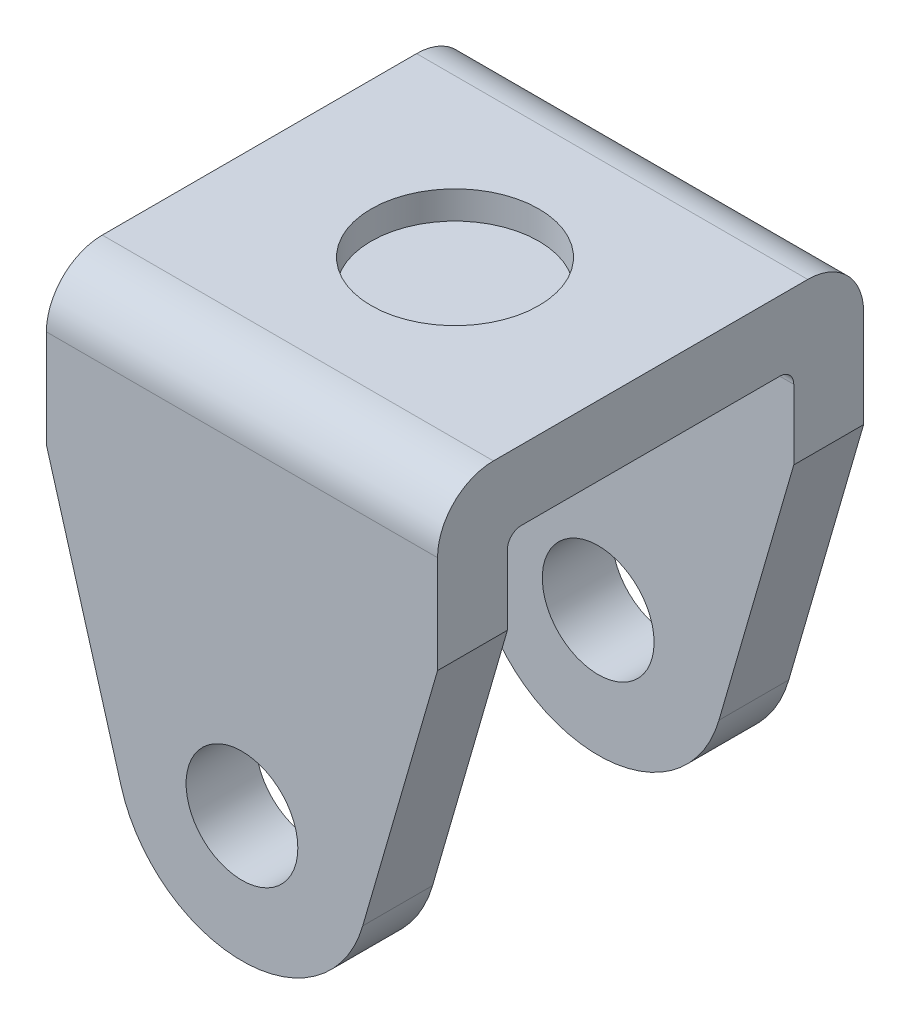
ISO-10303-21;
HEADER;
FILE_DESCRIPTION(('STEP AP214'),'2;1');
FILE_NAME('part.step','',(''),(''),'','','');
FILE_SCHEMA(('AUTOMOTIVE_DESIGN { 1 0 10303 214 1 1 1 1 }'));
ENDSEC;
DATA;
#1=APPLICATION_CONTEXT('core data for automotive mechanical design processes');
#2=APPLICATION_PROTOCOL_DEFINITION('international standard','automotive_design',2000,#1);
#3=PRODUCT_CONTEXT('',#1,'mechanical');
#4=PRODUCT('Part','Part','',(#3));
#5=PRODUCT_RELATED_PRODUCT_CATEGORY('part','',(#4));
#6=PRODUCT_DEFINITION_FORMATION('','',#4);
#7=PRODUCT_DEFINITION_CONTEXT('part definition',#1,'design');
#8=PRODUCT_DEFINITION('design','',#6,#7);
#9=PRODUCT_DEFINITION_SHAPE('','',#8);
#10=(LENGTH_UNIT() NAMED_UNIT(*) SI_UNIT(.MILLI.,.METRE.));
#11=(NAMED_UNIT(*) PLANE_ANGLE_UNIT() SI_UNIT($,.RADIAN.));
#12=(NAMED_UNIT(*) SI_UNIT($,.STERADIAN.) SOLID_ANGLE_UNIT());
#13=UNCERTAINTY_MEASURE_WITH_UNIT(LENGTH_MEASURE(1.E-05),#10,'distance_accuracy_value','');
#14=(GEOMETRIC_REPRESENTATION_CONTEXT(3) GLOBAL_UNCERTAINTY_ASSIGNED_CONTEXT((#13)) GLOBAL_UNIT_ASSIGNED_CONTEXT((#10,
#11,#12)) REPRESENTATION_CONTEXT('',''));
#15=CARTESIAN_POINT('',(0.,0.,0.));
#16=DIRECTION('',(0.,0.,1.));
#17=DIRECTION('',(1.,0.,0.));
#18=AXIS2_PLACEMENT_3D('',#15,#16,#17);
#19=CARTESIAN_POINT('',(0.,34.,0.));
#20=DIRECTION('',(0.,1.,0.));
#21=DIRECTION('',(0.,0.,1.));
#22=AXIS2_PLACEMENT_3D('',#19,#20,#21);
#23=PLANE('',#22);
#24=CARTESIAN_POINT('',(0.,34.,0.));
#25=DIRECTION('',(0.,1.,0.));
#26=DIRECTION('',(0.,0.,1.));
#27=AXIS2_PLACEMENT_3D('',#24,#25,#26);
#28=CIRCLE('',#27,6.);
#29=CARTESIAN_POINT('',(0.,34.,6.));
#30=VERTEX_POINT('',#29);
#31=EDGE_CURVE('E20',#30,#30,#28,.T.);
#32=ORIENTED_EDGE('',*,*,#31,.T.);
#33=EDGE_LOOP('',(#32));
#34=FACE_BOUND('',#33,.T.);
#35=ADVANCED_FACE('F17',(#34),#23,.T.);
#36=CARTESIAN_POINT('',(0.,34.,0.));
#37=DIRECTION('',(0.,1.,0.));
#38=DIRECTION('',(0.,0.,1.));
#39=AXIS2_PLACEMENT_3D('',#36,#37,#38);
#40=CYLINDRICAL_SURFACE('',#39,6.);
#41=CARTESIAN_POINT('',(0.,36.,0.));
#42=DIRECTION('',(0.,1.,0.));
#43=DIRECTION('',(0.,0.,1.));
#44=AXIS2_PLACEMENT_3D('',#41,#42,#43);
#45=CIRCLE('',#44,6.);
#46=CARTESIAN_POINT('',(0.,36.,6.));
#47=VERTEX_POINT('',#46);
#48=EDGE_CURVE('E147',#47,#47,#45,.F.);
#49=ORIENTED_EDGE('',*,*,#48,.F.);
#50=EDGE_LOOP('',(#49));
#51=FACE_BOUND('',#50,.T.);
#52=ORIENTED_EDGE('',*,*,#31,.F.);
#53=EDGE_LOOP('',(#52));
#54=FACE_BOUND('',#53,.T.);
#55=ADVANCED_FACE('F500',(#51,#54),#40,.F.);
#56=CARTESIAN_POINT('',(-14.,30.,9.25));
#57=DIRECTION('',(-1.,0.,0.));
#58=DIRECTION('',(0.,0.,1.));
#59=AXIS2_PLACEMENT_3D('',#56,#57,#58);
#60=CYLINDRICAL_SURFACE('',#59,1.);
#61=DIRECTION('',(1.,0.,0.));
#62=VECTOR('',#61,1.);
#63=CARTESIAN_POINT('',(-14.,31.,9.25));
#64=LINE('',#63,#62);
#65=CARTESIAN_POINT('',(-14.,31.,9.25));
#66=VERTEX_POINT('',#65);
#67=CARTESIAN_POINT('',(14.,31.,9.25));
#68=VERTEX_POINT('',#67);
#69=EDGE_CURVE('E141',#66,#68,#64,.T.);
#70=ORIENTED_EDGE('',*,*,#69,.T.);
#71=CARTESIAN_POINT('',(14.,30.,9.25));
#72=DIRECTION('',(-1.,0.,0.));
#73=DIRECTION('',(0.,0.,1.));
#74=AXIS2_PLACEMENT_3D('',#71,#72,#73);
#75=CIRCLE('',#74,1.);
#76=CARTESIAN_POINT('',(14.,30.,10.25));
#77=VERTEX_POINT('',#76);
#78=EDGE_CURVE('E129',#77,#68,#75,.T.);
#79=ORIENTED_EDGE('',*,*,#78,.F.);
#80=DIRECTION('',(1.,0.,0.));
#81=VECTOR('',#80,1.);
#82=CARTESIAN_POINT('',(-14.,30.,10.25));
#83=LINE('',#82,#81);
#84=CARTESIAN_POINT('',(-14.,30.,10.25));
#85=VERTEX_POINT('',#84);
#86=EDGE_CURVE('E250',#77,#85,#83,.F.);
#87=ORIENTED_EDGE('',*,*,#86,.T.);
#88=CARTESIAN_POINT('',(-14.,30.,9.25));
#89=DIRECTION('',(-1.,0.,0.));
#90=DIRECTION('',(0.,0.,1.));
#91=AXIS2_PLACEMENT_3D('',#88,#89,#90);
#92=CIRCLE('',#91,1.);
#93=EDGE_CURVE('E139',#66,#85,#92,.F.);
#94=ORIENTED_EDGE('',*,*,#93,.F.);
#95=EDGE_LOOP('',(#70,#79,#87,#94));
#96=FACE_BOUND('',#95,.T.);
#97=ADVANCED_FACE('F142',(#96),#60,.F.);
#98=CARTESIAN_POINT('',(0.,9.,-15.25));
#99=DIRECTION('',(0.,0.,1.));
#100=DIRECTION('',(1.,0.,0.));
#101=AXIS2_PLACEMENT_3D('',#98,#99,#100);
#102=CYLINDRICAL_SURFACE('',#101,9.00000000000001);
#103=CARTESIAN_POINT('',(0.,9.,10.25));
#104=DIRECTION('',(0.,0.,1.));
#105=DIRECTION('',(1.,0.,0.));
#106=AXIS2_PLACEMENT_3D('',#103,#104,#105);
#107=CIRCLE('',#106,9.00000000000001);
#108=CARTESIAN_POINT('',(-8.64521212595838,6.49793938978643,10.25));
#109=VERTEX_POINT('',#108);
#110=CARTESIAN_POINT('',(8.64521212595838,6.49793938978643,10.25));
#111=VERTEX_POINT('',#110);
#112=EDGE_CURVE('E249',#109,#111,#107,.T.);
#113=ORIENTED_EDGE('',*,*,#112,.T.);
#114=DIRECTION('',(0.,0.,1.));
#115=VECTOR('',#114,1.);
#116=CARTESIAN_POINT('',(8.64521212595838,6.49793938978642,-15.25));
#117=LINE('',#116,#115);
#118=CARTESIAN_POINT('',(8.64521212595838,6.49793938978643,15.25));
#119=VERTEX_POINT('',#118);
#120=EDGE_CURVE('E230',#111,#119,#117,.T.);
#121=ORIENTED_EDGE('',*,*,#120,.T.);
#122=CARTESIAN_POINT('',(0.,9.,15.25));
#123=DIRECTION('',(0.,0.,1.));
#124=DIRECTION('',(1.,0.,0.));
#125=AXIS2_PLACEMENT_3D('',#122,#123,#124);
#126=CIRCLE('',#125,9.00000000000001);
#127=CARTESIAN_POINT('',(-8.64521212595838,6.49793938978643,15.25));
#128=VERTEX_POINT('',#127);
#129=EDGE_CURVE('E224',#119,#128,#126,.F.);
#130=ORIENTED_EDGE('',*,*,#129,.T.);
#131=DIRECTION('',(0.,0.,1.));
#132=VECTOR('',#131,1.);
#133=CARTESIAN_POINT('',(-8.64521212595838,6.49793938978642,-15.25));
#134=LINE('',#133,#132);
#135=EDGE_CURVE('E266',#128,#109,#134,.F.);
#136=ORIENTED_EDGE('',*,*,#135,.T.);
#137=EDGE_LOOP('',(#113,#121,#130,#136));
#138=FACE_BOUND('',#137,.T.);
#139=ADVANCED_FACE('F368',(#138),#102,.T.);
#140=CARTESIAN_POINT('',(0.,9.,-15.25));
#141=DIRECTION('',(0.,0.,1.));
#142=DIRECTION('',(1.,0.,0.));
#143=AXIS2_PLACEMENT_3D('',#140,#141,#142);
#144=CYLINDRICAL_SURFACE('',#143,4.);
#145=CARTESIAN_POINT('',(0.,9.,15.25));
#146=DIRECTION('',(0.,0.,1.));
#147=DIRECTION('',(1.,0.,0.));
#148=AXIS2_PLACEMENT_3D('',#145,#146,#147);
#149=CIRCLE('',#148,4.);
#150=CARTESIAN_POINT('',(4.,9.,15.25));
#151=VERTEX_POINT('',#150);
#152=EDGE_CURVE('E259',#151,#151,#149,.T.);
#153=ORIENTED_EDGE('',*,*,#152,.T.);
#154=EDGE_LOOP('',(#153));
#155=FACE_BOUND('',#154,.T.);
#156=CARTESIAN_POINT('',(0.,9.,10.25));
#157=DIRECTION('',(0.,0.,1.));
#158=DIRECTION('',(1.,0.,0.));
#159=AXIS2_PLACEMENT_3D('',#156,#157,#158);
#160=CIRCLE('',#159,4.);
#161=CARTESIAN_POINT('',(4.,9.,10.25));
#162=VERTEX_POINT('',#161);
#163=EDGE_CURVE('E243',#162,#162,#160,.F.);
#164=ORIENTED_EDGE('',*,*,#163,.T.);
#165=EDGE_LOOP('',(#164));
#166=FACE_BOUND('',#165,.T.);
#167=ADVANCED_FACE('F360',(#155,#166),#144,.F.);
#168=CARTESIAN_POINT('',(-14.,30.,-9.25));
#169=DIRECTION('',(-1.,0.,0.));
#170=DIRECTION('',(0.,0.,1.));
#171=AXIS2_PLACEMENT_3D('',#168,#169,#170);
#172=CYLINDRICAL_SURFACE('',#171,0.999999999999999);
#173=DIRECTION('',(-1.,0.,0.));
#174=VECTOR('',#173,1.);
#175=CARTESIAN_POINT('',(-14.,30.,-10.25));
#176=LINE('',#175,#174);
#177=CARTESIAN_POINT('',(-14.,30.,-10.25));
#178=VERTEX_POINT('',#177);
#179=CARTESIAN_POINT('',(14.,30.,-10.25));
#180=VERTEX_POINT('',#179);
#181=EDGE_CURVE('E255',#178,#180,#176,.F.);
#182=ORIENTED_EDGE('',*,*,#181,.T.);
#183=CARTESIAN_POINT('',(14.,30.,-9.25));
#184=DIRECTION('',(-1.,0.,0.));
#185=DIRECTION('',(0.,0.,1.));
#186=AXIS2_PLACEMENT_3D('',#183,#184,#185);
#187=CIRCLE('',#186,0.999999999999999);
#188=CARTESIAN_POINT('',(14.,31.,-9.25));
#189=VERTEX_POINT('',#188);
#190=EDGE_CURVE('E302',#189,#180,#187,.T.);
#191=ORIENTED_EDGE('',*,*,#190,.F.);
#192=DIRECTION('',(1.,0.,0.));
#193=VECTOR('',#192,1.);
#194=CARTESIAN_POINT('',(-14.,31.,-9.25));
#195=LINE('',#194,#193);
#196=CARTESIAN_POINT('',(-14.,31.,-9.25));
#197=VERTEX_POINT('',#196);
#198=EDGE_CURVE('E146',#189,#197,#195,.F.);
#199=ORIENTED_EDGE('',*,*,#198,.T.);
#200=CARTESIAN_POINT('',(-14.,30.,-9.25));
#201=DIRECTION('',(-1.,0.,0.));
#202=DIRECTION('',(0.,0.,1.));
#203=AXIS2_PLACEMENT_3D('',#200,#201,#202);
#204=CIRCLE('',#203,0.999999999999999);
#205=EDGE_CURVE('E276',#178,#197,#204,.F.);
#206=ORIENTED_EDGE('',*,*,#205,.F.);
#207=EDGE_LOOP('',(#182,#191,#199,#206));
#208=FACE_BOUND('',#207,.T.);
#209=ADVANCED_FACE('F358',(#208),#172,.F.);
#210=CARTESIAN_POINT('',(-8.64521212595838,6.49793938978642,-15.25));
#211=DIRECTION('',(0.960579125106486,0.278006734468175,0.));
#212=DIRECTION('',(-0.278006734468175,0.960579125106486,0.));
#213=AXIS2_PLACEMENT_3D('',#210,#211,#212);
#214=PLANE('',#213);
#215=DIRECTION('',(-0.278006734468175,0.960579125106486,0.));
#216=VECTOR('',#215,1.);
#217=CARTESIAN_POINT('',(-8.64521212595838,6.49793938978642,15.25));
#218=LINE('',#217,#216);
#219=CARTESIAN_POINT('',(-14.,25.,15.25));
#220=VERTEX_POINT('',#219);
#221=EDGE_CURVE('E228',#128,#220,#218,.T.);
#222=ORIENTED_EDGE('',*,*,#221,.T.);
#223=DIRECTION('',(0.,0.,-1.));
#224=VECTOR('',#223,1.);
#225=CARTESIAN_POINT('',(-14.,25.,-15.25));
#226=LINE('',#225,#224);
#227=CARTESIAN_POINT('',(-14.,25.,10.25));
#228=VERTEX_POINT('',#227);
#229=EDGE_CURVE('E208',#220,#228,#226,.T.);
#230=ORIENTED_EDGE('',*,*,#229,.T.);
#231=DIRECTION('',(0.278006734468175,-0.960579125106486,0.));
#232=VECTOR('',#231,1.);
#233=CARTESIAN_POINT('',(-14.,25.,10.25));
#234=LINE('',#233,#232);
#235=EDGE_CURVE('E246',#228,#109,#234,.T.);
#236=ORIENTED_EDGE('',*,*,#235,.T.);
#237=ORIENTED_EDGE('',*,*,#135,.F.);
#238=EDGE_LOOP('',(#222,#230,#236,#237));
#239=FACE_BOUND('',#238,.T.);
#240=ADVANCED_FACE('F312',(#239),#214,.F.);
#241=CARTESIAN_POINT('',(0.,32.,11.25));
#242=DIRECTION('',(-1.,0.,0.));
#243=DIRECTION('',(0.,0.,1.));
#244=AXIS2_PLACEMENT_3D('',#241,#242,#243);
#245=CYLINDRICAL_SURFACE('',#244,4.);
#246=CARTESIAN_POINT('',(14.,32.,11.25));
#247=DIRECTION('',(-1.,0.,0.));
#248=DIRECTION('',(0.,0.,1.));
#249=AXIS2_PLACEMENT_3D('',#246,#247,#248);
#250=CIRCLE('',#249,4.);
#251=CARTESIAN_POINT('',(14.,32.,15.25));
#252=VERTEX_POINT('',#251);
#253=CARTESIAN_POINT('',(14.,36.,11.25));
#254=VERTEX_POINT('',#253);
#255=EDGE_CURVE('E167',#252,#254,#250,.T.);
#256=ORIENTED_EDGE('',*,*,#255,.T.);
#257=DIRECTION('',(1.,0.,0.));
#258=VECTOR('',#257,1.);
#259=CARTESIAN_POINT('',(0.,36.,11.25));
#260=LINE('',#259,#258);
#261=CARTESIAN_POINT('',(-14.,36.,11.25));
#262=VERTEX_POINT('',#261);
#263=EDGE_CURVE('E264',#262,#254,#260,.T.);
#264=ORIENTED_EDGE('',*,*,#263,.F.);
#265=CARTESIAN_POINT('',(-14.,32.,11.25));
#266=DIRECTION('',(-1.,0.,0.));
#267=DIRECTION('',(0.,0.,1.));
#268=AXIS2_PLACEMENT_3D('',#265,#266,#267);
#269=CIRCLE('',#268,4.);
#270=CARTESIAN_POINT('',(-14.,32.,15.25));
#271=VERTEX_POINT('',#270);
#272=EDGE_CURVE('E214',#262,#271,#269,.F.);
#273=ORIENTED_EDGE('',*,*,#272,.T.);
#274=DIRECTION('',(-1.,0.,0.));
#275=VECTOR('',#274,1.);
#276=CARTESIAN_POINT('',(-14.,32.,15.25));
#277=LINE('',#276,#275);
#278=EDGE_CURVE('E225',#271,#252,#277,.F.);
#279=ORIENTED_EDGE('',*,*,#278,.T.);
#280=EDGE_LOOP('',(#256,#264,#273,#279));
#281=FACE_BOUND('',#280,.T.);
#282=ADVANCED_FACE('F322',(#281),#245,.T.);
#283=CARTESIAN_POINT('',(0.,36.,0.));
#284=DIRECTION('',(0.,1.,0.));
#285=DIRECTION('',(0.,0.,1.));
#286=AXIS2_PLACEMENT_3D('',#283,#284,#285);
#287=PLANE('',#286);
#288=ORIENTED_EDGE('',*,*,#48,.T.);
#289=EDGE_LOOP('',(#288));
#290=FACE_BOUND('',#289,.T.);
#291=DIRECTION('',(0.,0.,-1.));
#292=VECTOR('',#291,1.);
#293=CARTESIAN_POINT('',(-14.,36.,-15.25));
#294=LINE('',#293,#292);
#295=CARTESIAN_POINT('',(-14.,36.,-11.25));
#296=VERTEX_POINT('',#295);
#297=EDGE_CURVE('E217',#296,#262,#294,.F.);
#298=ORIENTED_EDGE('',*,*,#297,.T.);
#299=ORIENTED_EDGE('',*,*,#263,.T.);
#300=DIRECTION('',(0.,0.,1.));
#301=VECTOR('',#300,1.);
#302=CARTESIAN_POINT('',(14.,36.,-15.25));
#303=LINE('',#302,#301);
#304=CARTESIAN_POINT('',(14.,36.,-11.25));
#305=VERTEX_POINT('',#304);
#306=EDGE_CURVE('E163',#254,#305,#303,.F.);
#307=ORIENTED_EDGE('',*,*,#306,.T.);
#308=DIRECTION('',(1.,0.,0.));
#309=VECTOR('',#308,1.);
#310=CARTESIAN_POINT('',(0.,36.,-11.25));
#311=LINE('',#310,#309);
#312=EDGE_CURVE('E258',#296,#305,#311,.T.);
#313=ORIENTED_EDGE('',*,*,#312,.F.);
#314=EDGE_LOOP('',(#298,#299,#307,#313));
#315=FACE_BOUND('',#314,.T.);
#316=ADVANCED_FACE('F325',(#290,#315),#287,.T.);
#317=CARTESIAN_POINT('',(-14.,31.,10.25));
#318=DIRECTION('',(0.,1.,0.));
#319=DIRECTION('',(0.,0.,1.));
#320=AXIS2_PLACEMENT_3D('',#317,#318,#319);
#321=PLANE('',#320);
#322=ORIENTED_EDGE('',*,*,#198,.F.);
#323=DIRECTION('',(0.,0.,1.));
#324=VECTOR('',#323,1.);
#325=CARTESIAN_POINT('',(14.,31.,-15.25));
#326=LINE('',#325,#324);
#327=EDGE_CURVE('E136',#189,#68,#326,.T.);
#328=ORIENTED_EDGE('',*,*,#327,.T.);
#329=ORIENTED_EDGE('',*,*,#69,.F.);
#330=DIRECTION('',(0.,0.,-1.));
#331=VECTOR('',#330,1.);
#332=CARTESIAN_POINT('',(-14.,31.,-15.25));
#333=LINE('',#332,#331);
#334=EDGE_CURVE('E201',#66,#197,#333,.T.);
#335=ORIENTED_EDGE('',*,*,#334,.T.);
#336=EDGE_LOOP('',(#322,#328,#329,#335));
#337=FACE_BOUND('',#336,.T.);
#338=ADVANCED_FACE('F150',(#337),#321,.F.);
#339=CARTESIAN_POINT('',(-14.,31.,10.25));
#340=DIRECTION('',(0.,0.,1.));
#341=DIRECTION('',(1.,0.,0.));
#342=AXIS2_PLACEMENT_3D('',#339,#340,#341);
#343=PLANE('',#342);
#344=ORIENTED_EDGE('',*,*,#163,.F.);
#345=EDGE_LOOP('',(#344));
#346=FACE_BOUND('',#345,.T.);
#347=DIRECTION('',(-0.278006734468175,-0.960579125106486,0.));
#348=VECTOR('',#347,1.);
#349=CARTESIAN_POINT('',(8.64521212595838,6.49793938978642,10.25));
#350=LINE('',#349,#348);
#351=CARTESIAN_POINT('',(14.,25.,10.25));
#352=VERTEX_POINT('',#351);
#353=EDGE_CURVE('E240',#352,#111,#350,.T.);
#354=ORIENTED_EDGE('',*,*,#353,.T.);
#355=ORIENTED_EDGE('',*,*,#112,.F.);
#356=ORIENTED_EDGE('',*,*,#235,.F.);
#357=DIRECTION('',(0.,1.,0.));
#358=VECTOR('',#357,1.);
#359=CARTESIAN_POINT('',(-14.,36.,10.25));
#360=LINE('',#359,#358);
#361=EDGE_CURVE('E205',#228,#85,#360,.T.);
#362=ORIENTED_EDGE('',*,*,#361,.T.);
#363=ORIENTED_EDGE('',*,*,#86,.F.);
#364=DIRECTION('',(0.,1.,0.));
#365=VECTOR('',#364,1.);
#366=CARTESIAN_POINT('',(14.,36.,10.25));
#367=LINE('',#366,#365);
#368=EDGE_CURVE('E138',#77,#352,#367,.F.);
#369=ORIENTED_EDGE('',*,*,#368,.T.);
#370=EDGE_LOOP('',(#354,#355,#356,#362,#363,#369));
#371=FACE_BOUND('',#370,.T.);
#372=ADVANCED_FACE('F309',(#346,#371),#343,.F.);
#373=CARTESIAN_POINT('',(8.64521212595838,6.49793938978642,-15.25));
#374=DIRECTION('',(-0.960579125106486,0.278006734468175,0.));
#375=DIRECTION('',(-0.278006734468175,-0.960579125106486,0.));
#376=AXIS2_PLACEMENT_3D('',#373,#374,#375);
#377=PLANE('',#376);
#378=DIRECTION('',(-0.278006734468175,-0.960579125106486,0.));
#379=VECTOR('',#378,1.);
#380=CARTESIAN_POINT('',(14.,25.,15.25));
#381=LINE('',#380,#379);
#382=CARTESIAN_POINT('',(14.,25.,15.25));
#383=VERTEX_POINT('',#382);
#384=EDGE_CURVE('E221',#383,#119,#381,.T.);
#385=ORIENTED_EDGE('',*,*,#384,.T.);
#386=ORIENTED_EDGE('',*,*,#120,.F.);
#387=ORIENTED_EDGE('',*,*,#353,.F.);
#388=DIRECTION('',(0.,0.,1.));
#389=VECTOR('',#388,1.);
#390=CARTESIAN_POINT('',(14.,25.,-15.25));
#391=LINE('',#390,#389);
#392=EDGE_CURVE('E154',#352,#383,#391,.T.);
#393=ORIENTED_EDGE('',*,*,#392,.T.);
#394=EDGE_LOOP('',(#385,#386,#387,#393));
#395=FACE_BOUND('',#394,.T.);
#396=ADVANCED_FACE('F401',(#395),#377,.F.);
#397=CARTESIAN_POINT('',(-14.,36.,15.25));
#398=DIRECTION('',(0.,0.,-1.));
#399=DIRECTION('',(-1.,0.,0.));
#400=AXIS2_PLACEMENT_3D('',#397,#398,#399);
#401=PLANE('',#400);
#402=ORIENTED_EDGE('',*,*,#152,.F.);
#403=EDGE_LOOP('',(#402));
#404=FACE_BOUND('',#403,.T.);
#405=ORIENTED_EDGE('',*,*,#384,.F.);
#406=DIRECTION('',(0.,1.,0.));
#407=VECTOR('',#406,1.);
#408=CARTESIAN_POINT('',(14.,36.,15.25));
#409=LINE('',#408,#407);
#410=EDGE_CURVE('E237',#383,#252,#409,.T.);
#411=ORIENTED_EDGE('',*,*,#410,.T.);
#412=ORIENTED_EDGE('',*,*,#278,.F.);
#413=DIRECTION('',(0.,1.,0.));
#414=VECTOR('',#413,1.);
#415=CARTESIAN_POINT('',(-14.,36.,15.25));
#416=LINE('',#415,#414);
#417=EDGE_CURVE('E211',#271,#220,#416,.F.);
#418=ORIENTED_EDGE('',*,*,#417,.T.);
#419=ORIENTED_EDGE('',*,*,#221,.F.);
#420=ORIENTED_EDGE('',*,*,#129,.F.);
#421=EDGE_LOOP('',(#405,#411,#412,#418,#419,#420));
#422=FACE_BOUND('',#421,.T.);
#423=ADVANCED_FACE('F317',(#404,#422),#401,.F.);
#424=CARTESIAN_POINT('',(-14.,31.,-10.25));
#425=DIRECTION('',(0.,0.,-1.));
#426=DIRECTION('',(-1.,0.,0.));
#427=AXIS2_PLACEMENT_3D('',#424,#425,#426);
#428=PLANE('',#427);
#429=CARTESIAN_POINT('',(0.,9.,-10.25));
#430=DIRECTION('',(0.,0.,1.));
#431=DIRECTION('',(1.,0.,0.));
#432=AXIS2_PLACEMENT_3D('',#429,#430,#431);
#433=CIRCLE('',#432,4.);
#434=CARTESIAN_POINT('',(4.,9.,-10.25));
#435=VERTEX_POINT('',#434);
#436=EDGE_CURVE('E172',#435,#435,#433,.F.);
#437=ORIENTED_EDGE('',*,*,#436,.T.);
#438=EDGE_LOOP('',(#437));
#439=FACE_BOUND('',#438,.T.);
#440=DIRECTION('',(-0.278006734468175,-0.960579125106486,0.));
#441=VECTOR('',#440,1.);
#442=CARTESIAN_POINT('',(8.64521212595838,6.49793938978642,-10.25));
#443=LINE('',#442,#441);
#444=CARTESIAN_POINT('',(8.64521212595838,6.49793938978643,-10.25));
#445=VERTEX_POINT('',#444);
#446=CARTESIAN_POINT('',(14.,25.,-10.25));
#447=VERTEX_POINT('',#446);
#448=EDGE_CURVE('E183',#445,#447,#443,.F.);
#449=ORIENTED_EDGE('',*,*,#448,.T.);
#450=DIRECTION('',(0.,1.,0.));
#451=VECTOR('',#450,1.);
#452=CARTESIAN_POINT('',(14.,36.,-10.25));
#453=LINE('',#452,#451);
#454=EDGE_CURVE('E152',#447,#180,#453,.T.);
#455=ORIENTED_EDGE('',*,*,#454,.T.);
#456=ORIENTED_EDGE('',*,*,#181,.F.);
#457=DIRECTION('',(0.,1.,0.));
#458=VECTOR('',#457,1.);
#459=CARTESIAN_POINT('',(-14.,36.,-10.25));
#460=LINE('',#459,#458);
#461=CARTESIAN_POINT('',(-14.,25.,-10.25));
#462=VERTEX_POINT('',#461);
#463=EDGE_CURVE('E198',#178,#462,#460,.F.);
#464=ORIENTED_EDGE('',*,*,#463,.T.);
#465=DIRECTION('',(-0.278006734468175,0.960579125106486,0.));
#466=VECTOR('',#465,1.);
#467=CARTESIAN_POINT('',(-8.64521212595838,6.49793938978642,-10.25));
#468=LINE('',#467,#466);
#469=CARTESIAN_POINT('',(-8.64521212595838,6.49793938978643,-10.25));
#470=VERTEX_POINT('',#469);
#471=EDGE_CURVE('E190',#462,#470,#468,.F.);
#472=ORIENTED_EDGE('',*,*,#471,.T.);
#473=CARTESIAN_POINT('',(0.,9.,-10.25));
#474=DIRECTION('',(0.,0.,1.));
#475=DIRECTION('',(1.,0.,0.));
#476=AXIS2_PLACEMENT_3D('',#473,#474,#475);
#477=CIRCLE('',#476,9.00000000000001);
#478=EDGE_CURVE('E186',#445,#470,#477,.F.);
#479=ORIENTED_EDGE('',*,*,#478,.F.);
#480=EDGE_LOOP('',(#449,#455,#456,#464,#472,#479));
#481=FACE_BOUND('',#480,.T.);
#482=ADVANCED_FACE('F355',(#439,#481),#428,.F.);
#483=CARTESIAN_POINT('',(0.,32.,-11.25));
#484=DIRECTION('',(1.,0.,0.));
#485=DIRECTION('',(0.,0.,-1.));
#486=AXIS2_PLACEMENT_3D('',#483,#484,#485);
#487=CYLINDRICAL_SURFACE('',#486,4.);
#488=CARTESIAN_POINT('',(-14.,32.,-11.25));
#489=DIRECTION('',(1.,0.,0.));
#490=DIRECTION('',(0.,0.,-1.));
#491=AXIS2_PLACEMENT_3D('',#488,#489,#490);
#492=CIRCLE('',#491,4.);
#493=CARTESIAN_POINT('',(-14.,32.,-15.25));
#494=VERTEX_POINT('',#493);
#495=EDGE_CURVE('E220',#494,#296,#492,.T.);
#496=ORIENTED_EDGE('',*,*,#495,.T.);
#497=ORIENTED_EDGE('',*,*,#312,.T.);
#498=CARTESIAN_POINT('',(14.,32.,-11.25));
#499=DIRECTION('',(1.,0.,0.));
#500=DIRECTION('',(0.,0.,-1.));
#501=AXIS2_PLACEMENT_3D('',#498,#499,#500);
#502=CIRCLE('',#501,4.);
#503=CARTESIAN_POINT('',(14.,32.,-15.25));
#504=VERTEX_POINT('',#503);
#505=EDGE_CURVE('E166',#305,#504,#502,.F.);
#506=ORIENTED_EDGE('',*,*,#505,.T.);
#507=DIRECTION('',(1.,0.,0.));
#508=VECTOR('',#507,1.);
#509=CARTESIAN_POINT('',(-14.,32.,-15.25));
#510=LINE('',#509,#508);
#511=EDGE_CURVE('E168',#504,#494,#510,.F.);
#512=ORIENTED_EDGE('',*,*,#511,.T.);
#513=EDGE_LOOP('',(#496,#497,#506,#512));
#514=FACE_BOUND('',#513,.T.);
#515=ADVANCED_FACE('F329',(#514),#487,.T.);
#516=CARTESIAN_POINT('',(-14.,36.,-15.25));
#517=DIRECTION('',(1.,0.,0.));
#518=DIRECTION('',(0.,0.,-1.));
#519=AXIS2_PLACEMENT_3D('',#516,#517,#518);
#520=PLANE('',#519);
#521=DIRECTION('',(0.,0.,1.));
#522=VECTOR('',#521,1.);
#523=CARTESIAN_POINT('',(-14.,25.,-15.25));
#524=LINE('',#523,#522);
#525=CARTESIAN_POINT('',(-14.,25.,-15.25));
#526=VERTEX_POINT('',#525);
#527=EDGE_CURVE('E187',#526,#462,#524,.T.);
#528=ORIENTED_EDGE('',*,*,#527,.T.);
#529=ORIENTED_EDGE('',*,*,#463,.F.);
#530=ORIENTED_EDGE('',*,*,#205,.T.);
#531=ORIENTED_EDGE('',*,*,#334,.F.);
#532=ORIENTED_EDGE('',*,*,#93,.T.);
#533=ORIENTED_EDGE('',*,*,#361,.F.);
#534=ORIENTED_EDGE('',*,*,#229,.F.);
#535=ORIENTED_EDGE('',*,*,#417,.F.);
#536=ORIENTED_EDGE('',*,*,#272,.F.);
#537=ORIENTED_EDGE('',*,*,#297,.F.);
#538=ORIENTED_EDGE('',*,*,#495,.F.);
#539=DIRECTION('',(0.,1.,0.));
#540=VECTOR('',#539,1.);
#541=CARTESIAN_POINT('',(-14.,36.,-15.25));
#542=LINE('',#541,#540);
#543=EDGE_CURVE('E171',#494,#526,#542,.F.);
#544=ORIENTED_EDGE('',*,*,#543,.T.);
#545=EDGE_LOOP('',(#528,#529,#530,#531,#532,#533,#534,#535,#536,#537,#538,#544));
#546=FACE_BOUND('',#545,.T.);
#547=ADVANCED_FACE('F306',(#546),#520,.F.);
#548=CARTESIAN_POINT('',(-8.64521212595838,6.49793938978642,-15.25));
#549=DIRECTION('',(0.960579125106486,0.278006734468175,0.));
#550=DIRECTION('',(-0.278006734468175,0.960579125106486,0.));
#551=AXIS2_PLACEMENT_3D('',#548,#549,#550);
#552=PLANE('',#551);
#553=DIRECTION('',(0.278006734468175,-0.960579125106486,0.));
#554=VECTOR('',#553,1.);
#555=CARTESIAN_POINT('',(-14.,25.,-15.25));
#556=LINE('',#555,#554);
#557=CARTESIAN_POINT('',(-8.64521212595838,6.49793938978643,-15.25));
#558=VERTEX_POINT('',#557);
#559=EDGE_CURVE('E195',#526,#558,#556,.T.);
#560=ORIENTED_EDGE('',*,*,#559,.T.);
#561=DIRECTION('',(0.,0.,1.));
#562=VECTOR('',#561,1.);
#563=CARTESIAN_POINT('',(-8.64521212595838,6.49793938978643,-15.25));
#564=LINE('',#563,#562);
#565=EDGE_CURVE('E184',#470,#558,#564,.F.);
#566=ORIENTED_EDGE('',*,*,#565,.F.);
#567=ORIENTED_EDGE('',*,*,#471,.F.);
#568=ORIENTED_EDGE('',*,*,#527,.F.);
#569=EDGE_LOOP('',(#560,#566,#567,#568));
#570=FACE_BOUND('',#569,.T.);
#571=ADVANCED_FACE('F351',(#570),#552,.F.);
#572=CARTESIAN_POINT('',(0.,9.,-15.25));
#573=DIRECTION('',(0.,0.,1.));
#574=DIRECTION('',(1.,0.,0.));
#575=AXIS2_PLACEMENT_3D('',#572,#573,#574);
#576=CYLINDRICAL_SURFACE('',#575,9.00000000000001);
#577=CARTESIAN_POINT('',(0.,9.,-15.25));
#578=DIRECTION('',(0.,0.,1.));
#579=DIRECTION('',(1.,0.,0.));
#580=AXIS2_PLACEMENT_3D('',#577,#578,#579);
#581=CIRCLE('',#580,9.00000000000001);
#582=CARTESIAN_POINT('',(8.64521212595838,6.49793938978643,-15.25));
#583=VERTEX_POINT('',#582);
#584=EDGE_CURVE('E278',#558,#583,#581,.T.);
#585=ORIENTED_EDGE('',*,*,#584,.T.);
#586=DIRECTION('',(0.,0.,1.));
#587=VECTOR('',#586,1.);
#588=CARTESIAN_POINT('',(8.64521212595838,6.49793938978642,-15.25));
#589=LINE('',#588,#587);
#590=EDGE_CURVE('E180',#583,#445,#589,.T.);
#591=ORIENTED_EDGE('',*,*,#590,.T.);
#592=ORIENTED_EDGE('',*,*,#478,.T.);
#593=ORIENTED_EDGE('',*,*,#565,.T.);
#594=EDGE_LOOP('',(#585,#591,#592,#593));
#595=FACE_BOUND('',#594,.T.);
#596=ADVANCED_FACE('F386',(#595),#576,.T.);
#597=CARTESIAN_POINT('',(8.64521212595838,6.49793938978642,-15.25));
#598=DIRECTION('',(-0.960579125106486,0.278006734468175,0.));
#599=DIRECTION('',(-0.278006734468175,-0.960579125106486,0.));
#600=AXIS2_PLACEMENT_3D('',#597,#598,#599);
#601=PLANE('',#600);
#602=DIRECTION('',(0.278006734468174,0.960579125106486,0.));
#603=VECTOR('',#602,1.);
#604=CARTESIAN_POINT('',(8.64521212595838,6.49793938978642,-15.25));
#605=LINE('',#604,#603);
#606=CARTESIAN_POINT('',(14.,25.,-15.25));
#607=VERTEX_POINT('',#606);
#608=EDGE_CURVE('E174',#583,#607,#605,.T.);
#609=ORIENTED_EDGE('',*,*,#608,.T.);
#610=DIRECTION('',(0.,0.,1.));
#611=VECTOR('',#610,1.);
#612=CARTESIAN_POINT('',(14.,25.,-15.25));
#613=LINE('',#612,#611);
#614=EDGE_CURVE('E35',#607,#447,#613,.T.);
#615=ORIENTED_EDGE('',*,*,#614,.T.);
#616=ORIENTED_EDGE('',*,*,#448,.F.);
#617=ORIENTED_EDGE('',*,*,#590,.F.);
#618=EDGE_LOOP('',(#609,#615,#616,#617));
#619=FACE_BOUND('',#618,.T.);
#620=ADVANCED_FACE('F337',(#619),#601,.F.);
#621=CARTESIAN_POINT('',(14.,36.,-15.25));
#622=DIRECTION('',(-1.,0.,0.));
#623=DIRECTION('',(0.,0.,1.));
#624=AXIS2_PLACEMENT_3D('',#621,#622,#623);
#625=PLANE('',#624);
#626=ORIENTED_EDGE('',*,*,#392,.F.);
#627=ORIENTED_EDGE('',*,*,#368,.F.);
#628=ORIENTED_EDGE('',*,*,#78,.T.);
#629=ORIENTED_EDGE('',*,*,#327,.F.);
#630=ORIENTED_EDGE('',*,*,#190,.T.);
#631=ORIENTED_EDGE('',*,*,#454,.F.);
#632=ORIENTED_EDGE('',*,*,#614,.F.);
#633=DIRECTION('',(0.,1.,0.));
#634=VECTOR('',#633,1.);
#635=CARTESIAN_POINT('',(14.,36.,-15.25));
#636=LINE('',#635,#634);
#637=EDGE_CURVE('E26',#607,#504,#636,.T.);
#638=ORIENTED_EDGE('',*,*,#637,.T.);
#639=ORIENTED_EDGE('',*,*,#505,.F.);
#640=ORIENTED_EDGE('',*,*,#306,.F.);
#641=ORIENTED_EDGE('',*,*,#255,.F.);
#642=ORIENTED_EDGE('',*,*,#410,.F.);
#643=EDGE_LOOP('',(#626,#627,#628,#629,#630,#631,#632,#638,#639,#640,#641,#642));
#644=FACE_BOUND('',#643,.T.);
#645=ADVANCED_FACE('F134',(#644),#625,.F.);
#646=CARTESIAN_POINT('',(0.,9.,-15.25));
#647=DIRECTION('',(0.,0.,1.));
#648=DIRECTION('',(1.,0.,0.));
#649=AXIS2_PLACEMENT_3D('',#646,#647,#648);
#650=CYLINDRICAL_SURFACE('',#649,4.);
#651=ORIENTED_EDGE('',*,*,#436,.F.);
#652=EDGE_LOOP('',(#651));
#653=FACE_BOUND('',#652,.T.);
#654=CARTESIAN_POINT('',(0.,9.,-15.25));
#655=DIRECTION('',(0.,0.,1.));
#656=DIRECTION('',(1.,0.,0.));
#657=AXIS2_PLACEMENT_3D('',#654,#655,#656);
#658=CIRCLE('',#657,4.);
#659=CARTESIAN_POINT('',(4.,9.,-15.25));
#660=VERTEX_POINT('',#659);
#661=EDGE_CURVE('E11',#660,#660,#658,.F.);
#662=ORIENTED_EDGE('',*,*,#661,.T.);
#663=EDGE_LOOP('',(#662));
#664=FACE_BOUND('',#663,.T.);
#665=ADVANCED_FACE('F372',(#653,#664),#650,.F.);
#666=CARTESIAN_POINT('',(-14.,36.,-15.25));
#667=DIRECTION('',(0.,0.,1.));
#668=DIRECTION('',(1.,0.,0.));
#669=AXIS2_PLACEMENT_3D('',#666,#667,#668);
#670=PLANE('',#669);
#671=ORIENTED_EDGE('',*,*,#661,.F.);
#672=EDGE_LOOP('',(#671));
#673=FACE_BOUND('',#672,.T.);
#674=ORIENTED_EDGE('',*,*,#608,.F.);
#675=ORIENTED_EDGE('',*,*,#584,.F.);
#676=ORIENTED_EDGE('',*,*,#559,.F.);
#677=ORIENTED_EDGE('',*,*,#543,.F.);
#678=ORIENTED_EDGE('',*,*,#511,.F.);
#679=ORIENTED_EDGE('',*,*,#637,.F.);
#680=EDGE_LOOP('',(#674,#675,#676,#677,#678,#679));
#681=FACE_BOUND('',#680,.T.);
#682=ADVANCED_FACE('F333',(#673,#681),#670,.F.);
#683=CLOSED_SHELL('',(#35,#55,#97,#139,#167,#209,#240,#282,#316,#338,#372,#396,#423,#482,#515,
#547,#571,#596,#620,#645,#665,#682));
#684=MANIFOLD_SOLID_BREP('B1',#683);
#685=ADVANCED_BREP_SHAPE_REPRESENTATION('',(#18,#684),#14);
#686=SHAPE_DEFINITION_REPRESENTATION(#9,#685);
ENDSEC;
END-ISO-10303-21;
